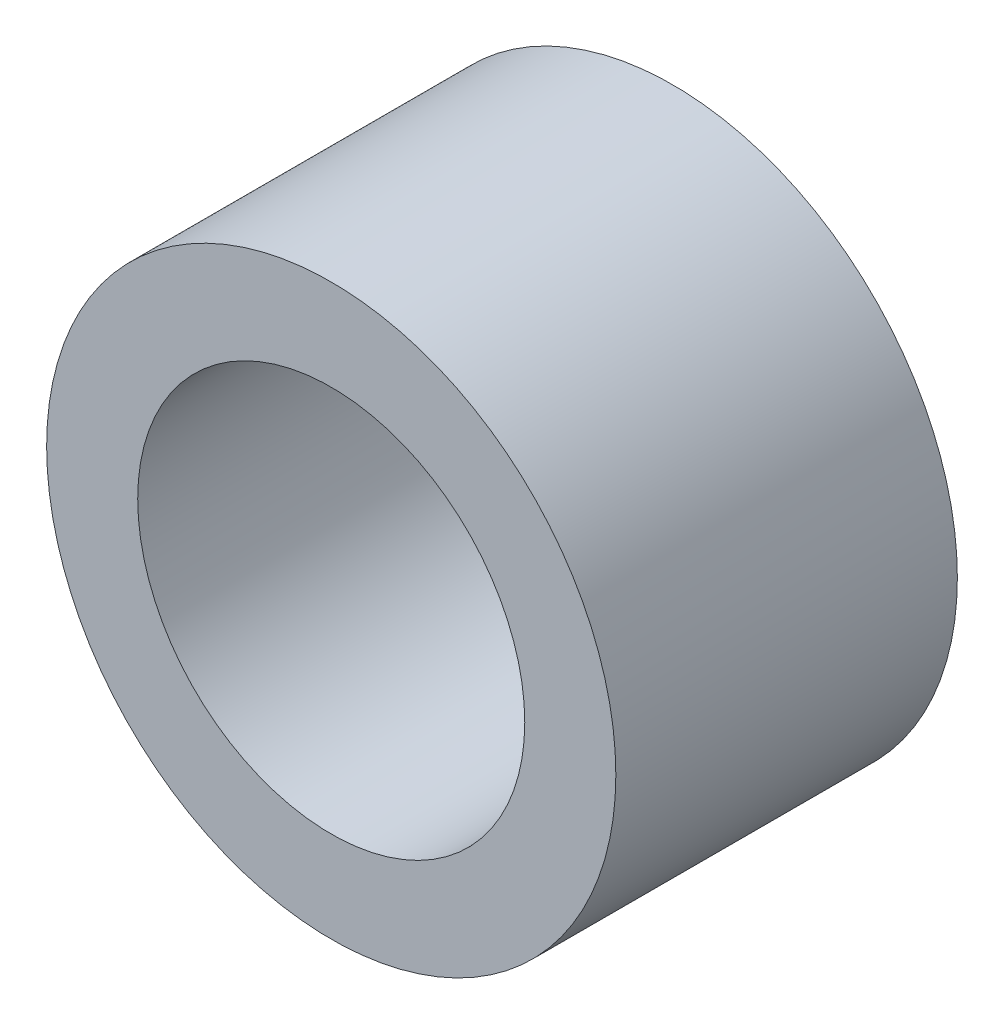
ISO-10303-21;
HEADER;
FILE_DESCRIPTION(('STEP AP214'),'2;1');
FILE_NAME('part.step','',(''),(''),'','','');
FILE_SCHEMA(('AUTOMOTIVE_DESIGN { 1 0 10303 214 1 1 1 1 }'));
ENDSEC;
DATA;
#1=APPLICATION_CONTEXT('core data for automotive mechanical design processes');
#2=APPLICATION_PROTOCOL_DEFINITION('international standard','automotive_design',2000,#1);
#3=PRODUCT_CONTEXT('',#1,'mechanical');
#4=PRODUCT('Part','Part','',(#3));
#5=PRODUCT_RELATED_PRODUCT_CATEGORY('part','',(#4));
#6=PRODUCT_DEFINITION_FORMATION('','',#4);
#7=PRODUCT_DEFINITION_CONTEXT('part definition',#1,'design');
#8=PRODUCT_DEFINITION('design','',#6,#7);
#9=PRODUCT_DEFINITION_SHAPE('','',#8);
#10=(LENGTH_UNIT() NAMED_UNIT(*) SI_UNIT(.MILLI.,.METRE.));
#11=(NAMED_UNIT(*) PLANE_ANGLE_UNIT() SI_UNIT($,.RADIAN.));
#12=(NAMED_UNIT(*) SI_UNIT($,.STERADIAN.) SOLID_ANGLE_UNIT());
#13=UNCERTAINTY_MEASURE_WITH_UNIT(LENGTH_MEASURE(1.E-05),#10,'distance_accuracy_value','');
#14=(GEOMETRIC_REPRESENTATION_CONTEXT(3) GLOBAL_UNCERTAINTY_ASSIGNED_CONTEXT((#13)) GLOBAL_UNIT_ASSIGNED_CONTEXT((#10,
#11,#12)) REPRESENTATION_CONTEXT('',''));
#15=CARTESIAN_POINT('',(0.,0.,0.));
#16=DIRECTION('',(0.,0.,1.));
#17=DIRECTION('',(1.,0.,0.));
#18=AXIS2_PLACEMENT_3D('',#15,#16,#17);
#19=CARTESIAN_POINT('',(0.,0.,3.));
#20=DIRECTION('',(0.,0.,-1.));
#21=DIRECTION('',(-1.,0.,0.));
#22=AXIS2_PLACEMENT_3D('',#19,#20,#21);
#23=CYLINDRICAL_SURFACE('',#22,2.5);
#24=CARTESIAN_POINT('',(0.,0.,3.));
#25=DIRECTION('',(0.,0.,1.));
#26=DIRECTION('',(1.,0.,0.));
#27=AXIS2_PLACEMENT_3D('',#24,#25,#26);
#28=CIRCLE('',#27,2.5);
#29=CARTESIAN_POINT('',(2.5,0.,3.));
#30=VERTEX_POINT('',#29);
#31=EDGE_CURVE('E10',#30,#30,#28,.T.);
#32=ORIENTED_EDGE('',*,*,#31,.F.);
#33=EDGE_LOOP('',(#32));
#34=FACE_BOUND('',#33,.T.);
#35=CARTESIAN_POINT('',(0.,0.,0.));
#36=DIRECTION('',(0.,0.,1.));
#37=DIRECTION('',(1.,0.,0.));
#38=AXIS2_PLACEMENT_3D('',#35,#36,#37);
#39=CIRCLE('',#38,2.5);
#40=CARTESIAN_POINT('',(2.5,0.,0.));
#41=VERTEX_POINT('',#40);
#42=EDGE_CURVE('E49',#41,#41,#39,.T.);
#43=ORIENTED_EDGE('',*,*,#42,.T.);
#44=EDGE_LOOP('',(#43));
#45=FACE_BOUND('',#44,.T.);
#46=ADVANCED_FACE('F41',(#34,#45),#23,.T.);
#47=CARTESIAN_POINT('',(0.,0.,3.));
#48=DIRECTION('',(0.,0.,1.));
#49=DIRECTION('',(1.,0.,0.));
#50=AXIS2_PLACEMENT_3D('',#47,#48,#49);
#51=PLANE('',#50);
#52=CARTESIAN_POINT('',(0.,0.,3.000012));
#53=DIRECTION('',(0.,0.,1.));
#54=DIRECTION('',(1.,0.,0.));
#55=AXIS2_PLACEMENT_3D('',#52,#53,#54);
#56=CIRCLE('',#55,1.7);
#57=CARTESIAN_POINT('',(1.7,0.,3.000012));
#58=VERTEX_POINT('',#57);
#59=EDGE_CURVE('E64',#58,#58,#56,.T.);
#60=ORIENTED_EDGE('',*,*,#59,.F.);
#61=EDGE_LOOP('',(#60));
#62=FACE_BOUND('',#61,.T.);
#63=ORIENTED_EDGE('',*,*,#31,.T.);
#64=EDGE_LOOP('',(#63));
#65=FACE_BOUND('',#64,.T.);
#66=ADVANCED_FACE('F67',(#62,#65),#51,.T.);
#67=CARTESIAN_POINT('',(0.,0.,0.));
#68=DIRECTION('',(0.,0.,1.));
#69=DIRECTION('',(1.,0.,0.));
#70=AXIS2_PLACEMENT_3D('',#67,#68,#69);
#71=PLANE('',#70);
#72=CARTESIAN_POINT('',(0.,0.,0.));
#73=DIRECTION('',(0.,0.,1.));
#74=DIRECTION('',(1.,0.,0.));
#75=AXIS2_PLACEMENT_3D('',#72,#73,#74);
#76=CIRCLE('',#75,1.7);
#77=CARTESIAN_POINT('',(1.7,0.,0.));
#78=VERTEX_POINT('',#77);
#79=EDGE_CURVE('E54',#78,#78,#76,.T.);
#80=ORIENTED_EDGE('',*,*,#79,.T.);
#81=EDGE_LOOP('',(#80));
#82=FACE_BOUND('',#81,.T.);
#83=ORIENTED_EDGE('',*,*,#42,.F.);
#84=EDGE_LOOP('',(#83));
#85=FACE_BOUND('',#84,.T.);
#86=ADVANCED_FACE('F75',(#82,#85),#71,.F.);
#87=CARTESIAN_POINT('',(0.,0.,0.));
#88=DIRECTION('',(0.,0.,1.));
#89=DIRECTION('',(1.,0.,0.));
#90=AXIS2_PLACEMENT_3D('',#87,#88,#89);
#91=CYLINDRICAL_SURFACE('',#90,1.7);
#92=ORIENTED_EDGE('',*,*,#79,.F.);
#93=EDGE_LOOP('',(#92));
#94=FACE_BOUND('',#93,.T.);
#95=ORIENTED_EDGE('',*,*,#59,.T.);
#96=EDGE_LOOP('',(#95));
#97=FACE_BOUND('',#96,.T.);
#98=ADVANCED_FACE('F73',(#94,#97),#91,.F.);
#99=CLOSED_SHELL('',(#46,#66,#86,#98));
#100=MANIFOLD_SOLID_BREP('B2',#99);
#101=ADVANCED_BREP_SHAPE_REPRESENTATION('',(#18,#100),#14);
#102=SHAPE_DEFINITION_REPRESENTATION(#9,#101);
ENDSEC;
END-ISO-10303-21;
